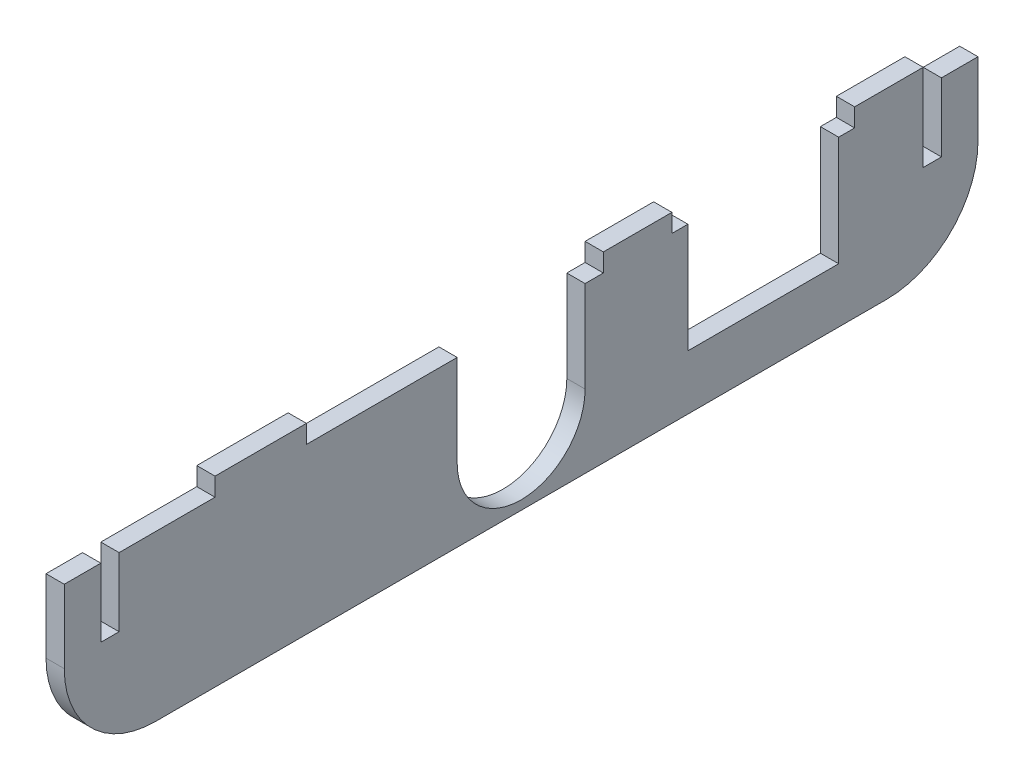
ISO-10303-21;
HEADER;
FILE_DESCRIPTION(('STEP AP214'),'2;1');
FILE_NAME('part.step','',(''),(''),'','','');
FILE_SCHEMA(('AUTOMOTIVE_DESIGN { 1 0 10303 214 1 1 1 1 }'));
ENDSEC;
DATA;
#1=APPLICATION_CONTEXT('core data for automotive mechanical design processes');
#2=APPLICATION_PROTOCOL_DEFINITION('international standard','automotive_design',2000,#1);
#3=PRODUCT_CONTEXT('',#1,'mechanical');
#4=PRODUCT('Part','Part','',(#3));
#5=PRODUCT_RELATED_PRODUCT_CATEGORY('part','',(#4));
#6=PRODUCT_DEFINITION_FORMATION('','',#4);
#7=PRODUCT_DEFINITION_CONTEXT('part definition',#1,'design');
#8=PRODUCT_DEFINITION('design','',#6,#7);
#9=PRODUCT_DEFINITION_SHAPE('','',#8);
#10=(LENGTH_UNIT() NAMED_UNIT(*) SI_UNIT(.MILLI.,.METRE.));
#11=(NAMED_UNIT(*) PLANE_ANGLE_UNIT() SI_UNIT($,.RADIAN.));
#12=(NAMED_UNIT(*) SI_UNIT($,.STERADIAN.) SOLID_ANGLE_UNIT());
#13=UNCERTAINTY_MEASURE_WITH_UNIT(LENGTH_MEASURE(1.E-05),#10,'distance_accuracy_value','');
#14=(GEOMETRIC_REPRESENTATION_CONTEXT(3) GLOBAL_UNCERTAINTY_ASSIGNED_CONTEXT((#13)) GLOBAL_UNIT_ASSIGNED_CONTEXT((#10,
#11,#12)) REPRESENTATION_CONTEXT('',''));
#15=CARTESIAN_POINT('',(0.,0.,0.));
#16=DIRECTION('',(0.,0.,1.));
#17=DIRECTION('',(1.,0.,0.));
#18=AXIS2_PLACEMENT_3D('',#15,#16,#17);
#19=CARTESIAN_POINT('',(5.08,45.72,0.));
#20=DIRECTION('',(0.,-1.,0.));
#21=DIRECTION('',(0.,0.,-1.));
#22=AXIS2_PLACEMENT_3D('',#19,#20,#21);
#23=PLANE('',#22);
#24=DIRECTION('',(0.,0.,1.));
#25=VECTOR('',#24,1.);
#26=CARTESIAN_POINT('',(0.,45.72,0.));
#27=LINE('',#26,#25);
#28=CARTESIAN_POINT('',(0.,45.72,-219.71));
#29=VERTEX_POINT('',#28);
#30=CARTESIAN_POINT('',(0.,45.72,-215.265));
#31=VERTEX_POINT('',#30);
#32=EDGE_CURVE('E258',#29,#31,#27,.T.);
#33=ORIENTED_EDGE('',*,*,#32,.T.);
#34=DIRECTION('',(1.,0.,0.));
#35=VECTOR('',#34,1.);
#36=CARTESIAN_POINT('',(0.,45.72,-215.265));
#37=LINE('',#36,#35);
#38=CARTESIAN_POINT('',(5.08,45.72,-215.265));
#39=VERTEX_POINT('',#38);
#40=EDGE_CURVE('E242',#31,#39,#37,.T.);
#41=ORIENTED_EDGE('',*,*,#40,.T.);
#42=DIRECTION('',(0.,0.,1.));
#43=VECTOR('',#42,1.);
#44=CARTESIAN_POINT('',(5.08,45.72,0.));
#45=LINE('',#44,#43);
#46=CARTESIAN_POINT('',(5.08,45.72,-219.71));
#47=VERTEX_POINT('',#46);
#48=EDGE_CURVE('E394',#47,#39,#45,.T.);
#49=ORIENTED_EDGE('',*,*,#48,.F.);
#50=DIRECTION('',(1.,0.,0.));
#51=VECTOR('',#50,1.);
#52=CARTESIAN_POINT('',(0.,45.72,-219.71));
#53=LINE('',#52,#51);
#54=EDGE_CURVE('E264',#29,#47,#53,.T.);
#55=ORIENTED_EDGE('',*,*,#54,.F.);
#56=EDGE_LOOP('',(#33,#41,#49,#55));
#57=FACE_BOUND('',#56,.T.);
#58=ADVANCED_FACE('F32',(#57),#23,.F.);
#59=DIRECTION('',(1.,0.,0.));
#60=VECTOR('',#59,1.);
#61=CARTESIAN_POINT('',(0.,45.72,-149.86));
#62=LINE('',#61,#60);
#63=CARTESIAN_POINT('',(0.,45.72,-149.86));
#64=VERTEX_POINT('',#63);
#65=CARTESIAN_POINT('',(5.08,45.72,-149.86));
#66=VERTEX_POINT('',#65);
#67=EDGE_CURVE('E501',#64,#66,#62,.T.);
#68=ORIENTED_EDGE('',*,*,#67,.F.);
#69=CARTESIAN_POINT('',(0.,45.72,-144.78));
#70=VERTEX_POINT('',#69);
#71=EDGE_CURVE('E269',#64,#70,#27,.T.);
#72=ORIENTED_EDGE('',*,*,#71,.T.);
#73=DIRECTION('',(1.,0.,0.));
#74=VECTOR('',#73,1.);
#75=CARTESIAN_POINT('',(0.,45.72,-144.78));
#76=LINE('',#75,#74);
#77=CARTESIAN_POINT('',(5.08,45.72,-144.78));
#78=VERTEX_POINT('',#77);
#79=EDGE_CURVE('E400',#70,#78,#76,.T.);
#80=ORIENTED_EDGE('',*,*,#79,.T.);
#81=EDGE_CURVE('E55',#66,#78,#45,.T.);
#82=ORIENTED_EDGE('',*,*,#81,.F.);
#83=EDGE_LOOP('',(#68,#72,#80,#82));
#84=FACE_BOUND('',#83,.T.);
#85=ADVANCED_FACE('F562',(#84),#23,.F.);
#86=CARTESIAN_POINT('',(5.08,45.72,-173.355));
#87=VERTEX_POINT('',#86);
#88=CARTESIAN_POINT('',(5.08,45.72,-168.91));
#89=VERTEX_POINT('',#88);
#90=EDGE_CURVE('E531',#87,#89,#45,.T.);
#91=ORIENTED_EDGE('',*,*,#90,.F.);
#92=DIRECTION('',(1.,0.,0.));
#93=VECTOR('',#92,1.);
#94=CARTESIAN_POINT('',(0.,45.72,-173.355));
#95=LINE('',#94,#93);
#96=CARTESIAN_POINT('',(0.,45.72,-173.355));
#97=VERTEX_POINT('',#96);
#98=EDGE_CURVE('E252',#97,#87,#95,.T.);
#99=ORIENTED_EDGE('',*,*,#98,.F.);
#100=CARTESIAN_POINT('',(0.,45.72,-168.91));
#101=VERTEX_POINT('',#100);
#102=EDGE_CURVE('E266',#97,#101,#27,.T.);
#103=ORIENTED_EDGE('',*,*,#102,.T.);
#104=DIRECTION('',(-1.,0.,0.));
#105=VECTOR('',#104,1.);
#106=CARTESIAN_POINT('',(0.,45.72,-168.91));
#107=LINE('',#106,#105);
#108=EDGE_CURVE('E497',#89,#101,#107,.T.);
#109=ORIENTED_EDGE('',*,*,#108,.F.);
#110=EDGE_LOOP('',(#91,#99,#103,#109));
#111=FACE_BOUND('',#110,.T.);
#112=ADVANCED_FACE('F529',(#111),#23,.F.);
#113=DIRECTION('',(1.,0.,0.));
#114=VECTOR('',#113,1.);
#115=CARTESIAN_POINT('',(-26.67,45.72,-243.84));
#116=LINE('',#115,#114);
#117=CARTESIAN_POINT('',(0.,45.72,-243.84));
#118=VERTEX_POINT('',#117);
#119=CARTESIAN_POINT('',(5.08,45.72,-243.84));
#120=VERTEX_POINT('',#119);
#121=EDGE_CURVE('E320',#118,#120,#116,.T.);
#122=ORIENTED_EDGE('',*,*,#121,.T.);
#123=CARTESIAN_POINT('',(5.08,45.72,-254.));
#124=VERTEX_POINT('',#123);
#125=EDGE_CURVE('E324',#124,#120,#45,.T.);
#126=ORIENTED_EDGE('',*,*,#125,.F.);
#127=DIRECTION('',(-1.,0.,0.));
#128=VECTOR('',#127,1.);
#129=CARTESIAN_POINT('',(5.08,45.72,-254.));
#130=LINE('',#129,#128);
#131=CARTESIAN_POINT('',(0.,45.72,-254.));
#132=VERTEX_POINT('',#131);
#133=EDGE_CURVE('E323',#124,#132,#130,.T.);
#134=ORIENTED_EDGE('',*,*,#133,.T.);
#135=EDGE_CURVE('E265',#132,#118,#27,.T.);
#136=ORIENTED_EDGE('',*,*,#135,.T.);
#137=EDGE_LOOP('',(#122,#126,#134,#136));
#138=FACE_BOUND('',#137,.T.);
#139=ADVANCED_FACE('F318',(#138),#23,.F.);
#140=CARTESIAN_POINT('',(5.08,0.,0.));
#141=DIRECTION('',(-1.,0.,0.));
#142=DIRECTION('',(0.,0.,1.));
#143=AXIS2_PLACEMENT_3D('',#140,#141,#142);
#144=PLANE('',#143);
#145=ORIENTED_EDGE('',*,*,#48,.T.);
#146=DIRECTION('',(0.,1.,0.));
#147=VECTOR('',#146,1.);
#148=CARTESIAN_POINT('',(5.08,15.24,-215.265));
#149=LINE('',#148,#147);
#150=CARTESIAN_POINT('',(5.08,15.24,-215.265));
#151=VERTEX_POINT('',#150);
#152=EDGE_CURVE('E247',#151,#39,#149,.T.);
#153=ORIENTED_EDGE('',*,*,#152,.F.);
#154=DIRECTION('',(0.,0.,-1.));
#155=VECTOR('',#154,1.);
#156=CARTESIAN_POINT('',(5.08,15.24,-173.355));
#157=LINE('',#156,#155);
#158=CARTESIAN_POINT('',(5.08,15.24,-173.355));
#159=VERTEX_POINT('',#158);
#160=EDGE_CURVE('E261',#159,#151,#157,.T.);
#161=ORIENTED_EDGE('',*,*,#160,.F.);
#162=DIRECTION('',(0.,-1.,0.));
#163=VECTOR('',#162,1.);
#164=CARTESIAN_POINT('',(5.08,15.24,-173.355));
#165=LINE('',#164,#163);
#166=EDGE_CURVE('E517',#87,#159,#165,.T.);
#167=ORIENTED_EDGE('',*,*,#166,.F.);
#168=ORIENTED_EDGE('',*,*,#90,.T.);
#169=DIRECTION('',(0.,-1.,0.));
#170=VECTOR('',#169,1.);
#171=CARTESIAN_POINT('',(5.08,50.8,-168.91));
#172=LINE('',#171,#170);
#173=CARTESIAN_POINT('',(5.08,50.8,-168.91));
#174=VERTEX_POINT('',#173);
#175=EDGE_CURVE('E490',#174,#89,#172,.T.);
#176=ORIENTED_EDGE('',*,*,#175,.F.);
#177=DIRECTION('',(0.,0.,-1.));
#178=VECTOR('',#177,1.);
#179=CARTESIAN_POINT('',(5.08,50.8,-168.91));
#180=LINE('',#179,#178);
#181=CARTESIAN_POINT('',(5.08,50.8,-149.86));
#182=VERTEX_POINT('',#181);
#183=EDGE_CURVE('E505',#182,#174,#180,.T.);
#184=ORIENTED_EDGE('',*,*,#183,.F.);
#185=DIRECTION('',(0.,-1.,0.));
#186=VECTOR('',#185,1.);
#187=CARTESIAN_POINT('',(5.08,50.8,-149.86));
#188=LINE('',#187,#186);
#189=EDGE_CURVE('E487',#182,#66,#188,.T.);
#190=ORIENTED_EDGE('',*,*,#189,.T.);
#191=ORIENTED_EDGE('',*,*,#81,.T.);
#192=DIRECTION('',(0.,1.,0.));
#193=VECTOR('',#192,1.);
#194=CARTESIAN_POINT('',(5.08,20.32,-144.78));
#195=LINE('',#194,#193);
#196=CARTESIAN_POINT('',(5.08,20.32,-144.78));
#197=VERTEX_POINT('',#196);
#198=EDGE_CURVE('E411',#197,#78,#195,.T.);
#199=ORIENTED_EDGE('',*,*,#198,.F.);
#200=CARTESIAN_POINT('',(5.08,20.32,-127.));
#201=DIRECTION('',(1.,0.,0.));
#202=DIRECTION('',(0.,0.,-1.));
#203=AXIS2_PLACEMENT_3D('',#200,#201,#202);
#204=CIRCLE('',#203,17.78);
#205=CARTESIAN_POINT('',(5.08,20.32,-109.22));
#206=VERTEX_POINT('',#205);
#207=EDGE_CURVE('E374',#206,#197,#204,.T.);
#208=ORIENTED_EDGE('',*,*,#207,.F.);
#209=DIRECTION('',(0.,-1.,0.));
#210=VECTOR('',#209,1.);
#211=CARTESIAN_POINT('',(5.08,20.32,-109.22));
#212=LINE('',#211,#210);
#213=CARTESIAN_POINT('',(5.08,45.72,-109.22));
#214=VERTEX_POINT('',#213);
#215=EDGE_CURVE('E415',#214,#206,#212,.T.);
#216=ORIENTED_EDGE('',*,*,#215,.F.);
#217=CARTESIAN_POINT('',(5.08,45.72,-67.31));
#218=VERTEX_POINT('',#217);
#219=EDGE_CURVE('E533',#214,#218,#45,.T.);
#220=ORIENTED_EDGE('',*,*,#219,.T.);
#221=DIRECTION('',(0.,-1.,0.));
#222=VECTOR('',#221,1.);
#223=CARTESIAN_POINT('',(5.08,50.8,-67.31));
#224=LINE('',#223,#222);
#225=CARTESIAN_POINT('',(5.08,50.8,-67.31));
#226=VERTEX_POINT('',#225);
#227=EDGE_CURVE('E425',#226,#218,#224,.T.);
#228=ORIENTED_EDGE('',*,*,#227,.F.);
#229=DIRECTION('',(0.,0.,-1.));
#230=VECTOR('',#229,1.);
#231=CARTESIAN_POINT('',(5.08,50.8,-41.91));
#232=LINE('',#231,#230);
#233=CARTESIAN_POINT('',(5.08,50.8,-41.91));
#234=VERTEX_POINT('',#233);
#235=EDGE_CURVE('E438',#234,#226,#232,.T.);
#236=ORIENTED_EDGE('',*,*,#235,.F.);
#237=DIRECTION('',(0.,-1.,0.));
#238=VECTOR('',#237,1.);
#239=CARTESIAN_POINT('',(5.08,50.8,-41.91));
#240=LINE('',#239,#238);
#241=CARTESIAN_POINT('',(5.08,45.72,-41.91));
#242=VERTEX_POINT('',#241);
#243=EDGE_CURVE('E422',#234,#242,#240,.T.);
#244=ORIENTED_EDGE('',*,*,#243,.T.);
#245=CARTESIAN_POINT('',(5.08,45.72,-15.24));
#246=VERTEX_POINT('',#245);
#247=EDGE_CURVE('E393',#242,#246,#45,.T.);
#248=ORIENTED_EDGE('',*,*,#247,.T.);
#249=DIRECTION('',(0.,1.,0.));
#250=VECTOR('',#249,1.);
#251=CARTESIAN_POINT('',(5.08,26.67,-15.24));
#252=LINE('',#251,#250);
#253=CARTESIAN_POINT('',(5.08,26.67,-15.24));
#254=VERTEX_POINT('',#253);
#255=EDGE_CURVE('E452',#254,#246,#252,.T.);
#256=ORIENTED_EDGE('',*,*,#255,.F.);
#257=DIRECTION('',(0.,0.,-1.));
#258=VECTOR('',#257,1.);
#259=CARTESIAN_POINT('',(5.08,26.67,-10.16));
#260=LINE('',#259,#258);
#261=CARTESIAN_POINT('',(5.08,26.67,-10.16));
#262=VERTEX_POINT('',#261);
#263=EDGE_CURVE('E444',#262,#254,#260,.T.);
#264=ORIENTED_EDGE('',*,*,#263,.F.);
#265=DIRECTION('',(0.,-1.,0.));
#266=VECTOR('',#265,1.);
#267=CARTESIAN_POINT('',(5.08,26.67,-10.16));
#268=LINE('',#267,#266);
#269=CARTESIAN_POINT('',(5.08,45.72,-10.16));
#270=VERTEX_POINT('',#269);
#271=EDGE_CURVE('E450',#270,#262,#268,.T.);
#272=ORIENTED_EDGE('',*,*,#271,.F.);
#273=CARTESIAN_POINT('',(5.08,45.72,0.));
#274=VERTEX_POINT('',#273);
#275=EDGE_CURVE('E360',#270,#274,#45,.T.);
#276=ORIENTED_EDGE('',*,*,#275,.T.);
#277=DIRECTION('',(0.,-1.,0.));
#278=VECTOR('',#277,1.);
#279=CARTESIAN_POINT('',(5.08,0.,0.));
#280=LINE('',#279,#278);
#281=CARTESIAN_POINT('',(5.08,25.4,0.));
#282=VERTEX_POINT('',#281);
#283=EDGE_CURVE('E271',#274,#282,#280,.T.);
#284=ORIENTED_EDGE('',*,*,#283,.T.);
#285=CARTESIAN_POINT('',(5.08,25.4,-25.4));
#286=DIRECTION('',(-1.,0.,0.));
#287=DIRECTION('',(0.,0.,1.));
#288=AXIS2_PLACEMENT_3D('',#285,#286,#287);
#289=CIRCLE('',#288,25.4);
#290=CARTESIAN_POINT('',(5.08,0.,-25.4));
#291=VERTEX_POINT('',#290);
#292=EDGE_CURVE('E343',#282,#291,#289,.F.);
#293=ORIENTED_EDGE('',*,*,#292,.T.);
#294=DIRECTION('',(0.,0.,-1.));
#295=VECTOR('',#294,1.);
#296=CARTESIAN_POINT('',(5.08,0.,0.));
#297=LINE('',#296,#295);
#298=CARTESIAN_POINT('',(5.08,0.,-228.6));
#299=VERTEX_POINT('',#298);
#300=EDGE_CURVE('E392',#291,#299,#297,.T.);
#301=ORIENTED_EDGE('',*,*,#300,.T.);
#302=CARTESIAN_POINT('',(5.08,25.4,-228.6));
#303=DIRECTION('',(-1.,0.,0.));
#304=DIRECTION('',(0.,0.,1.));
#305=AXIS2_PLACEMENT_3D('',#302,#303,#304);
#306=CIRCLE('',#305,25.4);
#307=CARTESIAN_POINT('',(5.08,25.4,-254.));
#308=VERTEX_POINT('',#307);
#309=EDGE_CURVE('E345',#299,#308,#306,.F.);
#310=ORIENTED_EDGE('',*,*,#309,.T.);
#311=DIRECTION('',(0.,1.,0.));
#312=VECTOR('',#311,1.);
#313=CARTESIAN_POINT('',(5.08,0.,-254.));
#314=LINE('',#313,#312);
#315=EDGE_CURVE('E391',#308,#124,#314,.T.);
#316=ORIENTED_EDGE('',*,*,#315,.T.);
#317=ORIENTED_EDGE('',*,*,#125,.T.);
#318=DIRECTION('',(0.,-1.,0.));
#319=VECTOR('',#318,1.);
#320=CARTESIAN_POINT('',(5.08,26.67,-243.84));
#321=LINE('',#320,#319);
#322=CARTESIAN_POINT('',(5.08,26.67,-243.84));
#323=VERTEX_POINT('',#322);
#324=EDGE_CURVE('E457',#120,#323,#321,.T.);
#325=ORIENTED_EDGE('',*,*,#324,.T.);
#326=DIRECTION('',(0.,0.,1.));
#327=VECTOR('',#326,1.);
#328=CARTESIAN_POINT('',(5.08,26.67,-243.84));
#329=LINE('',#328,#327);
#330=CARTESIAN_POINT('',(5.08,26.67,-238.76));
#331=VERTEX_POINT('',#330);
#332=EDGE_CURVE('E462',#323,#331,#329,.T.);
#333=ORIENTED_EDGE('',*,*,#332,.T.);
#334=DIRECTION('',(0.,1.,0.));
#335=VECTOR('',#334,1.);
#336=CARTESIAN_POINT('',(5.08,26.67,-238.76));
#337=LINE('',#336,#335);
#338=CARTESIAN_POINT('',(5.08,50.8,-238.76));
#339=VERTEX_POINT('',#338);
#340=EDGE_CURVE('E465',#331,#339,#337,.T.);
#341=ORIENTED_EDGE('',*,*,#340,.T.);
#342=DIRECTION('',(0.,0.,-1.));
#343=VECTOR('',#342,1.);
#344=CARTESIAN_POINT('',(5.08,50.8,-238.76));
#345=LINE('',#344,#343);
#346=CARTESIAN_POINT('',(5.08,50.8,-219.71));
#347=VERTEX_POINT('',#346);
#348=EDGE_CURVE('E478',#347,#339,#345,.T.);
#349=ORIENTED_EDGE('',*,*,#348,.F.);
#350=DIRECTION('',(0.,-1.,0.));
#351=VECTOR('',#350,1.);
#352=CARTESIAN_POINT('',(5.08,50.8,-219.71));
#353=LINE('',#352,#351);
#354=EDGE_CURVE('E469',#347,#47,#353,.T.);
#355=ORIENTED_EDGE('',*,*,#354,.T.);
#356=EDGE_LOOP('',(#145,#153,#161,#167,#168,#176,#184,#190,#191,#199,#208,#216,#220,#228,#236,
#244,#248,#256,#264,#272,#276,#284,#293,#301,#310,#316,#317,#325,#333,#341,#349,#355));
#357=FACE_BOUND('',#356,.T.);
#358=ADVANCED_FACE('F390',(#357),#144,.F.);
#359=CARTESIAN_POINT('',(0.,0.,0.));
#360=DIRECTION('',(-1.,0.,0.));
#361=DIRECTION('',(0.,0.,1.));
#362=AXIS2_PLACEMENT_3D('',#359,#360,#361);
#363=PLANE('',#362);
#364=DIRECTION('',(0.,1.,0.));
#365=VECTOR('',#364,1.);
#366=CARTESIAN_POINT('',(0.,15.24,-215.265));
#367=LINE('',#366,#365);
#368=CARTESIAN_POINT('',(0.,15.24,-215.265));
#369=VERTEX_POINT('',#368);
#370=EDGE_CURVE('E245',#369,#31,#367,.T.);
#371=ORIENTED_EDGE('',*,*,#370,.T.);
#372=ORIENTED_EDGE('',*,*,#32,.F.);
#373=DIRECTION('',(0.,-1.,0.));
#374=VECTOR('',#373,1.);
#375=CARTESIAN_POINT('',(0.,50.8,-219.71));
#376=LINE('',#375,#374);
#377=CARTESIAN_POINT('',(0.,50.8,-219.71));
#378=VERTEX_POINT('',#377);
#379=EDGE_CURVE('E467',#378,#29,#376,.T.);
#380=ORIENTED_EDGE('',*,*,#379,.F.);
#381=DIRECTION('',(0.,0.,1.));
#382=VECTOR('',#381,1.);
#383=CARTESIAN_POINT('',(0.,50.8,-238.76));
#384=LINE('',#383,#382);
#385=CARTESIAN_POINT('',(0.,50.8,-238.76));
#386=VERTEX_POINT('',#385);
#387=EDGE_CURVE('E474',#386,#378,#384,.T.);
#388=ORIENTED_EDGE('',*,*,#387,.F.);
#389=DIRECTION('',(0.,-1.,0.));
#390=VECTOR('',#389,1.);
#391=CARTESIAN_POINT('',(0.,0.,-238.76));
#392=LINE('',#391,#390);
#393=CARTESIAN_POINT('',(0.,26.67,-238.76));
#394=VERTEX_POINT('',#393);
#395=EDGE_CURVE('E11',#386,#394,#392,.T.);
#396=ORIENTED_EDGE('',*,*,#395,.T.);
#397=DIRECTION('',(0.,0.,-1.));
#398=VECTOR('',#397,1.);
#399=CARTESIAN_POINT('',(0.,26.67,0.));
#400=LINE('',#399,#398);
#401=CARTESIAN_POINT('',(0.,26.67,-243.84));
#402=VERTEX_POINT('',#401);
#403=EDGE_CURVE('E303',#394,#402,#400,.T.);
#404=ORIENTED_EDGE('',*,*,#403,.T.);
#405=DIRECTION('',(0.,1.,0.));
#406=VECTOR('',#405,1.);
#407=CARTESIAN_POINT('',(0.,0.,-243.84));
#408=LINE('',#407,#406);
#409=EDGE_CURVE('E40',#402,#118,#408,.T.);
#410=ORIENTED_EDGE('',*,*,#409,.T.);
#411=ORIENTED_EDGE('',*,*,#135,.F.);
#412=DIRECTION('',(0.,1.,0.));
#413=VECTOR('',#412,1.);
#414=CARTESIAN_POINT('',(0.,0.,-254.));
#415=LINE('',#414,#413);
#416=CARTESIAN_POINT('',(0.,25.4,-254.));
#417=VERTEX_POINT('',#416);
#418=EDGE_CURVE('E276',#417,#132,#415,.T.);
#419=ORIENTED_EDGE('',*,*,#418,.F.);
#420=CARTESIAN_POINT('',(0.,25.4,-228.6));
#421=DIRECTION('',(-1.,0.,0.));
#422=DIRECTION('',(0.,0.,1.));
#423=AXIS2_PLACEMENT_3D('',#420,#421,#422);
#424=CIRCLE('',#423,25.4);
#425=CARTESIAN_POINT('',(0.,0.,-228.6));
#426=VERTEX_POINT('',#425);
#427=EDGE_CURVE('E336',#417,#426,#424,.T.);
#428=ORIENTED_EDGE('',*,*,#427,.T.);
#429=DIRECTION('',(0.,0.,-1.));
#430=VECTOR('',#429,1.);
#431=CARTESIAN_POINT('',(0.,0.,0.));
#432=LINE('',#431,#430);
#433=CARTESIAN_POINT('',(0.,0.,-25.4));
#434=VERTEX_POINT('',#433);
#435=EDGE_CURVE('E368',#434,#426,#432,.T.);
#436=ORIENTED_EDGE('',*,*,#435,.F.);
#437=CARTESIAN_POINT('',(0.,25.4,-25.4));
#438=DIRECTION('',(-1.,0.,0.));
#439=DIRECTION('',(0.,0.,1.));
#440=AXIS2_PLACEMENT_3D('',#437,#438,#439);
#441=CIRCLE('',#440,25.4);
#442=CARTESIAN_POINT('',(0.,25.4,0.));
#443=VERTEX_POINT('',#442);
#444=EDGE_CURVE('E331',#434,#443,#441,.T.);
#445=ORIENTED_EDGE('',*,*,#444,.T.);
#446=DIRECTION('',(0.,-1.,0.));
#447=VECTOR('',#446,1.);
#448=CARTESIAN_POINT('',(0.,0.,0.));
#449=LINE('',#448,#447);
#450=CARTESIAN_POINT('',(0.,45.72,0.));
#451=VERTEX_POINT('',#450);
#452=EDGE_CURVE('E364',#451,#443,#449,.T.);
#453=ORIENTED_EDGE('',*,*,#452,.F.);
#454=CARTESIAN_POINT('',(0.,45.72,-10.16));
#455=VERTEX_POINT('',#454);
#456=EDGE_CURVE('E268',#455,#451,#27,.T.);
#457=ORIENTED_EDGE('',*,*,#456,.F.);
#458=DIRECTION('',(0.,1.,0.));
#459=VECTOR('',#458,1.);
#460=CARTESIAN_POINT('',(0.,0.,-10.16));
#461=LINE('',#460,#459);
#462=CARTESIAN_POINT('',(0.,26.67,-10.16));
#463=VERTEX_POINT('',#462);
#464=EDGE_CURVE('E307',#463,#455,#461,.T.);
#465=ORIENTED_EDGE('',*,*,#464,.F.);
#466=DIRECTION('',(0.,0.,1.));
#467=VECTOR('',#466,1.);
#468=CARTESIAN_POINT('',(0.,26.67,0.));
#469=LINE('',#468,#467);
#470=CARTESIAN_POINT('',(0.,26.67,-15.24));
#471=VERTEX_POINT('',#470);
#472=EDGE_CURVE('E300',#471,#463,#469,.T.);
#473=ORIENTED_EDGE('',*,*,#472,.F.);
#474=DIRECTION('',(0.,-1.,0.));
#475=VECTOR('',#474,1.);
#476=CARTESIAN_POINT('',(0.,0.,-15.24));
#477=LINE('',#476,#475);
#478=CARTESIAN_POINT('',(0.,45.72,-15.24));
#479=VERTEX_POINT('',#478);
#480=EDGE_CURVE('E297',#479,#471,#477,.T.);
#481=ORIENTED_EDGE('',*,*,#480,.F.);
#482=CARTESIAN_POINT('',(0.,45.72,-41.91));
#483=VERTEX_POINT('',#482);
#484=EDGE_CURVE('E275',#483,#479,#27,.T.);
#485=ORIENTED_EDGE('',*,*,#484,.F.);
#486=DIRECTION('',(0.,-1.,0.));
#487=VECTOR('',#486,1.);
#488=CARTESIAN_POINT('',(0.,50.8,-41.91));
#489=LINE('',#488,#487);
#490=CARTESIAN_POINT('',(0.,50.8,-41.91));
#491=VERTEX_POINT('',#490);
#492=EDGE_CURVE('E295',#491,#483,#489,.T.);
#493=ORIENTED_EDGE('',*,*,#492,.F.);
#494=DIRECTION('',(0.,0.,1.));
#495=VECTOR('',#494,1.);
#496=CARTESIAN_POINT('',(0.,50.8,-41.91));
#497=LINE('',#496,#495);
#498=CARTESIAN_POINT('',(0.,50.8,-67.31));
#499=VERTEX_POINT('',#498);
#500=EDGE_CURVE('E434',#499,#491,#497,.T.);
#501=ORIENTED_EDGE('',*,*,#500,.F.);
#502=DIRECTION('',(0.,-1.,0.));
#503=VECTOR('',#502,1.);
#504=CARTESIAN_POINT('',(0.,50.8,-67.31));
#505=LINE('',#504,#503);
#506=CARTESIAN_POINT('',(0.,45.72,-67.31));
#507=VERTEX_POINT('',#506);
#508=EDGE_CURVE('E428',#499,#507,#505,.T.);
#509=ORIENTED_EDGE('',*,*,#508,.T.);
#510=CARTESIAN_POINT('',(0.,45.72,-109.22));
#511=VERTEX_POINT('',#510);
#512=EDGE_CURVE('E272',#511,#507,#27,.T.);
#513=ORIENTED_EDGE('',*,*,#512,.F.);
#514=DIRECTION('',(0.,-1.,0.));
#515=VECTOR('',#514,1.);
#516=CARTESIAN_POINT('',(0.,20.32,-109.22));
#517=LINE('',#516,#515);
#518=CARTESIAN_POINT('',(0.,20.32,-109.22));
#519=VERTEX_POINT('',#518);
#520=EDGE_CURVE('E414',#511,#519,#517,.T.);
#521=ORIENTED_EDGE('',*,*,#520,.T.);
#522=CARTESIAN_POINT('',(0.,20.32,-127.));
#523=DIRECTION('',(1.,0.,0.));
#524=DIRECTION('',(0.,0.,-1.));
#525=AXIS2_PLACEMENT_3D('',#522,#523,#524);
#526=CIRCLE('',#525,17.78);
#527=CARTESIAN_POINT('',(0.,20.32,-144.78));
#528=VERTEX_POINT('',#527);
#529=EDGE_CURVE('E369',#519,#528,#526,.T.);
#530=ORIENTED_EDGE('',*,*,#529,.T.);
#531=DIRECTION('',(0.,1.,0.));
#532=VECTOR('',#531,1.);
#533=CARTESIAN_POINT('',(0.,20.32,-144.78));
#534=LINE('',#533,#532);
#535=EDGE_CURVE('E405',#528,#70,#534,.T.);
#536=ORIENTED_EDGE('',*,*,#535,.T.);
#537=ORIENTED_EDGE('',*,*,#71,.F.);
#538=DIRECTION('',(0.,-1.,0.));
#539=VECTOR('',#538,1.);
#540=CARTESIAN_POINT('',(0.,50.8,-149.86));
#541=LINE('',#540,#539);
#542=CARTESIAN_POINT('',(0.,50.8,-149.86));
#543=VERTEX_POINT('',#542);
#544=EDGE_CURVE('E475',#543,#64,#541,.T.);
#545=ORIENTED_EDGE('',*,*,#544,.F.);
#546=DIRECTION('',(0.,0.,1.));
#547=VECTOR('',#546,1.);
#548=CARTESIAN_POINT('',(0.,50.8,-168.91));
#549=LINE('',#548,#547);
#550=CARTESIAN_POINT('',(0.,50.8,-168.91));
#551=VERTEX_POINT('',#550);
#552=EDGE_CURVE('E500',#551,#543,#549,.T.);
#553=ORIENTED_EDGE('',*,*,#552,.F.);
#554=DIRECTION('',(0.,-1.,0.));
#555=VECTOR('',#554,1.);
#556=CARTESIAN_POINT('',(0.,50.8,-168.91));
#557=LINE('',#556,#555);
#558=EDGE_CURVE('E493',#551,#101,#557,.T.);
#559=ORIENTED_EDGE('',*,*,#558,.T.);
#560=ORIENTED_EDGE('',*,*,#102,.F.);
#561=DIRECTION('',(0.,-1.,0.));
#562=VECTOR('',#561,1.);
#563=CARTESIAN_POINT('',(0.,15.24,-173.355));
#564=LINE('',#563,#562);
#565=CARTESIAN_POINT('',(0.,15.24,-173.355));
#566=VERTEX_POINT('',#565);
#567=EDGE_CURVE('E260',#97,#566,#564,.T.);
#568=ORIENTED_EDGE('',*,*,#567,.T.);
#569=DIRECTION('',(0.,0.,-1.));
#570=VECTOR('',#569,1.);
#571=CARTESIAN_POINT('',(0.,15.24,-173.355));
#572=LINE('',#571,#570);
#573=EDGE_CURVE('E47',#566,#369,#572,.T.);
#574=ORIENTED_EDGE('',*,*,#573,.T.);
#575=EDGE_LOOP('',(#371,#372,#380,#388,#396,#404,#410,#411,#419,#428,#436,#445,#453,#457,#465,
#473,#481,#485,#493,#501,#509,#513,#521,#530,#536,#537,#545,#553,#559,#560,#568,#574));
#576=FACE_BOUND('',#575,.T.);
#577=ADVANCED_FACE('F256',(#576),#363,.T.);
#578=ORIENTED_EDGE('',*,*,#484,.T.);
#579=DIRECTION('',(1.,0.,0.));
#580=VECTOR('',#579,1.);
#581=CARTESIAN_POINT('',(-26.67,45.72,-15.24));
#582=LINE('',#581,#580);
#583=EDGE_CURVE('E287',#479,#246,#582,.T.);
#584=ORIENTED_EDGE('',*,*,#583,.T.);
#585=ORIENTED_EDGE('',*,*,#247,.F.);
#586=DIRECTION('',(1.,0.,0.));
#587=VECTOR('',#586,1.);
#588=CARTESIAN_POINT('',(5.08,45.72,-41.91));
#589=LINE('',#588,#587);
#590=EDGE_CURVE('E290',#483,#242,#589,.T.);
#591=ORIENTED_EDGE('',*,*,#590,.F.);
#592=EDGE_LOOP('',(#578,#584,#585,#591));
#593=FACE_BOUND('',#592,.T.);
#594=ADVANCED_FACE('F286',(#593),#23,.F.);
#595=ORIENTED_EDGE('',*,*,#275,.F.);
#596=DIRECTION('',(1.,0.,0.));
#597=VECTOR('',#596,1.);
#598=CARTESIAN_POINT('',(-26.67,45.72,-10.16));
#599=LINE('',#598,#597);
#600=EDGE_CURVE('E352',#455,#270,#599,.T.);
#601=ORIENTED_EDGE('',*,*,#600,.F.);
#602=ORIENTED_EDGE('',*,*,#456,.T.);
#603=DIRECTION('',(-1.,0.,0.));
#604=VECTOR('',#603,1.);
#605=CARTESIAN_POINT('',(5.08,45.72,0.));
#606=LINE('',#605,#604);
#607=EDGE_CURVE('E328',#274,#451,#606,.T.);
#608=ORIENTED_EDGE('',*,*,#607,.F.);
#609=EDGE_LOOP('',(#595,#601,#602,#608));
#610=FACE_BOUND('',#609,.T.);
#611=ADVANCED_FACE('F358',(#610),#23,.F.);
#612=DIRECTION('',(-1.,0.,0.));
#613=VECTOR('',#612,1.);
#614=CARTESIAN_POINT('',(5.08,45.72,-67.31));
#615=LINE('',#614,#613);
#616=EDGE_CURVE('E432',#218,#507,#615,.T.);
#617=ORIENTED_EDGE('',*,*,#616,.F.);
#618=ORIENTED_EDGE('',*,*,#219,.F.);
#619=DIRECTION('',(1.,0.,0.));
#620=VECTOR('',#619,1.);
#621=CARTESIAN_POINT('',(0.,45.72,-109.22));
#622=LINE('',#621,#620);
#623=EDGE_CURVE('E402',#511,#214,#622,.T.);
#624=ORIENTED_EDGE('',*,*,#623,.F.);
#625=ORIENTED_EDGE('',*,*,#512,.T.);
#626=EDGE_LOOP('',(#617,#618,#624,#625));
#627=FACE_BOUND('',#626,.T.);
#628=ADVANCED_FACE('F550',(#627),#23,.F.);
#629=CARTESIAN_POINT('',(5.08,0.,0.));
#630=DIRECTION('',(0.,0.,-1.));
#631=DIRECTION('',(-1.,0.,0.));
#632=AXIS2_PLACEMENT_3D('',#629,#630,#631);
#633=PLANE('',#632);
#634=ORIENTED_EDGE('',*,*,#452,.T.);
#635=DIRECTION('',(-1.,0.,0.));
#636=VECTOR('',#635,1.);
#637=CARTESIAN_POINT('',(5.08,25.4,0.));
#638=LINE('',#637,#636);
#639=EDGE_CURVE('E347',#443,#282,#638,.F.);
#640=ORIENTED_EDGE('',*,*,#639,.T.);
#641=ORIENTED_EDGE('',*,*,#283,.F.);
#642=ORIENTED_EDGE('',*,*,#607,.T.);
#643=EDGE_LOOP('',(#634,#640,#641,#642));
#644=FACE_BOUND('',#643,.T.);
#645=ADVANCED_FACE('F577',(#644),#633,.F.);
#646=CARTESIAN_POINT('',(5.08,0.,0.));
#647=DIRECTION('',(0.,1.,0.));
#648=DIRECTION('',(0.,0.,1.));
#649=AXIS2_PLACEMENT_3D('',#646,#647,#648);
#650=PLANE('',#649);
#651=ORIENTED_EDGE('',*,*,#435,.T.);
#652=DIRECTION('',(-1.,0.,0.));
#653=VECTOR('',#652,1.);
#654=CARTESIAN_POINT('',(5.08,0.,-228.6));
#655=LINE('',#654,#653);
#656=EDGE_CURVE('E341',#426,#299,#655,.F.);
#657=ORIENTED_EDGE('',*,*,#656,.T.);
#658=ORIENTED_EDGE('',*,*,#300,.F.);
#659=DIRECTION('',(-1.,0.,0.));
#660=VECTOR('',#659,1.);
#661=CARTESIAN_POINT('',(5.08,0.,-25.4));
#662=LINE('',#661,#660);
#663=EDGE_CURVE('E338',#291,#434,#662,.T.);
#664=ORIENTED_EDGE('',*,*,#663,.T.);
#665=EDGE_LOOP('',(#651,#657,#658,#664));
#666=FACE_BOUND('',#665,.T.);
#667=ADVANCED_FACE('F383',(#666),#650,.F.);
#668=CARTESIAN_POINT('',(5.08,0.,-254.));
#669=DIRECTION('',(0.,0.,1.));
#670=DIRECTION('',(1.,0.,0.));
#671=AXIS2_PLACEMENT_3D('',#668,#669,#670);
#672=PLANE('',#671);
#673=ORIENTED_EDGE('',*,*,#315,.F.);
#674=DIRECTION('',(-1.,0.,0.));
#675=VECTOR('',#674,1.);
#676=CARTESIAN_POINT('',(5.08,25.4,-254.));
#677=LINE('',#676,#675);
#678=EDGE_CURVE('E327',#308,#417,#677,.T.);
#679=ORIENTED_EDGE('',*,*,#678,.T.);
#680=ORIENTED_EDGE('',*,*,#418,.T.);
#681=ORIENTED_EDGE('',*,*,#133,.F.);
#682=EDGE_LOOP('',(#673,#679,#680,#681));
#683=FACE_BOUND('',#682,.T.);
#684=ADVANCED_FACE('F378',(#683),#672,.F.);
#685=CARTESIAN_POINT('',(0.,20.32,-127.));
#686=DIRECTION('',(1.,0.,0.));
#687=DIRECTION('',(0.,0.,-1.));
#688=AXIS2_PLACEMENT_3D('',#685,#686,#687);
#689=CYLINDRICAL_SURFACE('',#688,17.78);
#690=ORIENTED_EDGE('',*,*,#207,.T.);
#691=DIRECTION('',(1.,0.,0.));
#692=VECTOR('',#691,1.);
#693=CARTESIAN_POINT('',(0.,20.32,-144.78));
#694=LINE('',#693,#692);
#695=EDGE_CURVE('E408',#528,#197,#694,.T.);
#696=ORIENTED_EDGE('',*,*,#695,.F.);
#697=ORIENTED_EDGE('',*,*,#529,.F.);
#698=DIRECTION('',(1.,0.,0.));
#699=VECTOR('',#698,1.);
#700=CARTESIAN_POINT('',(0.,20.32,-109.22));
#701=LINE('',#700,#699);
#702=EDGE_CURVE('E404',#519,#206,#701,.T.);
#703=ORIENTED_EDGE('',*,*,#702,.T.);
#704=EDGE_LOOP('',(#690,#696,#697,#703));
#705=FACE_BOUND('',#704,.T.);
#706=ADVANCED_FACE('F557',(#705),#689,.F.);
#707=CARTESIAN_POINT('',(0.,20.32,-109.22));
#708=DIRECTION('',(0.,0.,1.));
#709=DIRECTION('',(1.,0.,0.));
#710=AXIS2_PLACEMENT_3D('',#707,#708,#709);
#711=PLANE('',#710);
#712=ORIENTED_EDGE('',*,*,#215,.T.);
#713=ORIENTED_EDGE('',*,*,#702,.F.);
#714=ORIENTED_EDGE('',*,*,#520,.F.);
#715=ORIENTED_EDGE('',*,*,#623,.T.);
#716=EDGE_LOOP('',(#712,#713,#714,#715));
#717=FACE_BOUND('',#716,.T.);
#718=ADVANCED_FACE('F552',(#717),#711,.F.);
#719=CARTESIAN_POINT('',(0.,20.32,-144.78));
#720=DIRECTION('',(0.,0.,-1.));
#721=DIRECTION('',(-1.,0.,0.));
#722=AXIS2_PLACEMENT_3D('',#719,#720,#721);
#723=PLANE('',#722);
#724=ORIENTED_EDGE('',*,*,#198,.T.);
#725=ORIENTED_EDGE('',*,*,#79,.F.);
#726=ORIENTED_EDGE('',*,*,#535,.F.);
#727=ORIENTED_EDGE('',*,*,#695,.T.);
#728=EDGE_LOOP('',(#724,#725,#726,#727));
#729=FACE_BOUND('',#728,.T.);
#730=ADVANCED_FACE('F561',(#729),#723,.F.);
#731=CARTESIAN_POINT('',(5.08,25.4,-228.6));
#732=DIRECTION('',(-1.,0.,0.));
#733=DIRECTION('',(0.,0.,1.));
#734=AXIS2_PLACEMENT_3D('',#731,#732,#733);
#735=CYLINDRICAL_SURFACE('',#734,25.4);
#736=ORIENTED_EDGE('',*,*,#309,.F.);
#737=ORIENTED_EDGE('',*,*,#656,.F.);
#738=ORIENTED_EDGE('',*,*,#427,.F.);
#739=ORIENTED_EDGE('',*,*,#678,.F.);
#740=EDGE_LOOP('',(#736,#737,#738,#739));
#741=FACE_BOUND('',#740,.T.);
#742=ADVANCED_FACE('F388',(#741),#735,.T.);
#743=CARTESIAN_POINT('',(5.08,25.4,-25.4));
#744=DIRECTION('',(-1.,0.,0.));
#745=DIRECTION('',(0.,0.,1.));
#746=AXIS2_PLACEMENT_3D('',#743,#744,#745);
#747=CYLINDRICAL_SURFACE('',#746,25.4);
#748=ORIENTED_EDGE('',*,*,#292,.F.);
#749=ORIENTED_EDGE('',*,*,#639,.F.);
#750=ORIENTED_EDGE('',*,*,#444,.F.);
#751=ORIENTED_EDGE('',*,*,#663,.F.);
#752=EDGE_LOOP('',(#748,#749,#750,#751));
#753=FACE_BOUND('',#752,.T.);
#754=ADVANCED_FACE('F34',(#753),#747,.T.);
#755=CARTESIAN_POINT('',(5.08,50.8,-41.91));
#756=DIRECTION('',(0.,0.,-1.));
#757=DIRECTION('',(-1.,0.,0.));
#758=AXIS2_PLACEMENT_3D('',#755,#756,#757);
#759=PLANE('',#758);
#760=ORIENTED_EDGE('',*,*,#590,.T.);
#761=ORIENTED_EDGE('',*,*,#243,.F.);
#762=DIRECTION('',(1.,0.,0.));
#763=VECTOR('',#762,1.);
#764=CARTESIAN_POINT('',(5.08,50.8,-41.91));
#765=LINE('',#764,#763);
#766=EDGE_CURVE('E440',#491,#234,#765,.T.);
#767=ORIENTED_EDGE('',*,*,#766,.F.);
#768=ORIENTED_EDGE('',*,*,#492,.T.);
#769=EDGE_LOOP('',(#760,#761,#767,#768));
#770=FACE_BOUND('',#769,.T.);
#771=ADVANCED_FACE('F543',(#770),#759,.F.);
#772=CARTESIAN_POINT('',(5.08,50.8,-67.31));
#773=DIRECTION('',(0.,0.,1.));
#774=DIRECTION('',(1.,0.,0.));
#775=AXIS2_PLACEMENT_3D('',#772,#773,#774);
#776=PLANE('',#775);
#777=ORIENTED_EDGE('',*,*,#616,.T.);
#778=ORIENTED_EDGE('',*,*,#508,.F.);
#779=DIRECTION('',(-1.,0.,0.));
#780=VECTOR('',#779,1.);
#781=CARTESIAN_POINT('',(5.08,50.8,-67.31));
#782=LINE('',#781,#780);
#783=EDGE_CURVE('E431',#226,#499,#782,.T.);
#784=ORIENTED_EDGE('',*,*,#783,.F.);
#785=ORIENTED_EDGE('',*,*,#227,.T.);
#786=EDGE_LOOP('',(#777,#778,#784,#785));
#787=FACE_BOUND('',#786,.T.);
#788=ADVANCED_FACE('F549',(#787),#776,.F.);
#789=CARTESIAN_POINT('',(0.,50.8,0.));
#790=DIRECTION('',(0.,1.,0.));
#791=DIRECTION('',(0.,0.,1.));
#792=AXIS2_PLACEMENT_3D('',#789,#790,#791);
#793=PLANE('',#792);
#794=ORIENTED_EDGE('',*,*,#500,.T.);
#795=ORIENTED_EDGE('',*,*,#766,.T.);
#796=ORIENTED_EDGE('',*,*,#235,.T.);
#797=ORIENTED_EDGE('',*,*,#783,.T.);
#798=EDGE_LOOP('',(#794,#795,#796,#797));
#799=FACE_BOUND('',#798,.T.);
#800=ADVANCED_FACE('F545',(#799),#793,.T.);
#801=CARTESIAN_POINT('',(-26.67,26.67,-15.24));
#802=DIRECTION('',(0.,0.,-1.));
#803=DIRECTION('',(-1.,0.,0.));
#804=AXIS2_PLACEMENT_3D('',#801,#802,#803);
#805=PLANE('',#804);
#806=ORIENTED_EDGE('',*,*,#480,.T.);
#807=DIRECTION('',(1.,0.,0.));
#808=VECTOR('',#807,1.);
#809=CARTESIAN_POINT('',(-26.67,26.67,-15.24));
#810=LINE('',#809,#808);
#811=EDGE_CURVE('E436',#471,#254,#810,.T.);
#812=ORIENTED_EDGE('',*,*,#811,.T.);
#813=ORIENTED_EDGE('',*,*,#255,.T.);
#814=ORIENTED_EDGE('',*,*,#583,.F.);
#815=EDGE_LOOP('',(#806,#812,#813,#814));
#816=FACE_BOUND('',#815,.T.);
#817=ADVANCED_FACE('F671',(#816),#805,.F.);
#818=CARTESIAN_POINT('',(-26.67,26.67,-10.16));
#819=DIRECTION('',(0.,-1.,0.));
#820=DIRECTION('',(0.,0.,-1.));
#821=AXIS2_PLACEMENT_3D('',#818,#819,#820);
#822=PLANE('',#821);
#823=ORIENTED_EDGE('',*,*,#472,.T.);
#824=DIRECTION('',(1.,0.,0.));
#825=VECTOR('',#824,1.);
#826=CARTESIAN_POINT('',(-26.67,26.67,-10.16));
#827=LINE('',#826,#825);
#828=EDGE_CURVE('E354',#463,#262,#827,.T.);
#829=ORIENTED_EDGE('',*,*,#828,.T.);
#830=ORIENTED_EDGE('',*,*,#263,.T.);
#831=ORIENTED_EDGE('',*,*,#811,.F.);
#832=EDGE_LOOP('',(#823,#829,#830,#831));
#833=FACE_BOUND('',#832,.T.);
#834=ADVANCED_FACE('F682',(#833),#822,.F.);
#835=CARTESIAN_POINT('',(-26.67,26.67,-10.16));
#836=DIRECTION('',(0.,0.,1.));
#837=DIRECTION('',(1.,0.,0.));
#838=AXIS2_PLACEMENT_3D('',#835,#836,#837);
#839=PLANE('',#838);
#840=ORIENTED_EDGE('',*,*,#464,.T.);
#841=ORIENTED_EDGE('',*,*,#600,.T.);
#842=ORIENTED_EDGE('',*,*,#271,.T.);
#843=ORIENTED_EDGE('',*,*,#828,.F.);
#844=EDGE_LOOP('',(#840,#841,#842,#843));
#845=FACE_BOUND('',#844,.T.);
#846=ADVANCED_FACE('F350',(#845),#839,.F.);
#847=CARTESIAN_POINT('',(-26.67,26.67,-238.76));
#848=DIRECTION('',(0.,0.,-1.));
#849=DIRECTION('',(-1.,0.,0.));
#850=AXIS2_PLACEMENT_3D('',#847,#848,#849);
#851=PLANE('',#850);
#852=ORIENTED_EDGE('',*,*,#395,.F.);
#853=DIRECTION('',(-1.,0.,0.));
#854=VECTOR('',#853,1.);
#855=CARTESIAN_POINT('',(0.,50.8,-238.76));
#856=LINE('',#855,#854);
#857=EDGE_CURVE('E472',#339,#386,#856,.T.);
#858=ORIENTED_EDGE('',*,*,#857,.F.);
#859=ORIENTED_EDGE('',*,*,#340,.F.);
#860=DIRECTION('',(1.,0.,0.));
#861=VECTOR('',#860,1.);
#862=CARTESIAN_POINT('',(-26.67,26.67,-238.76));
#863=LINE('',#862,#861);
#864=EDGE_CURVE('E454',#394,#331,#863,.T.);
#865=ORIENTED_EDGE('',*,*,#864,.F.);
#866=EDGE_LOOP('',(#852,#858,#859,#865));
#867=FACE_BOUND('',#866,.T.);
#868=ADVANCED_FACE('F698',(#867),#851,.T.);
#869=CARTESIAN_POINT('',(-26.67,26.67,-243.84));
#870=DIRECTION('',(0.,0.,1.));
#871=DIRECTION('',(1.,0.,0.));
#872=AXIS2_PLACEMENT_3D('',#869,#870,#871);
#873=PLANE('',#872);
#874=DIRECTION('',(1.,0.,0.));
#875=VECTOR('',#874,1.);
#876=CARTESIAN_POINT('',(-26.67,26.67,-243.84));
#877=LINE('',#876,#875);
#878=EDGE_CURVE('E456',#402,#323,#877,.T.);
#879=ORIENTED_EDGE('',*,*,#878,.T.);
#880=ORIENTED_EDGE('',*,*,#324,.F.);
#881=ORIENTED_EDGE('',*,*,#121,.F.);
#882=ORIENTED_EDGE('',*,*,#409,.F.);
#883=EDGE_LOOP('',(#879,#880,#881,#882));
#884=FACE_BOUND('',#883,.T.);
#885=ADVANCED_FACE('F732',(#884),#873,.T.);
#886=CARTESIAN_POINT('',(-26.67,26.67,-243.84));
#887=DIRECTION('',(0.,1.,0.));
#888=DIRECTION('',(0.,0.,1.));
#889=AXIS2_PLACEMENT_3D('',#886,#887,#888);
#890=PLANE('',#889);
#891=ORIENTED_EDGE('',*,*,#864,.T.);
#892=ORIENTED_EDGE('',*,*,#332,.F.);
#893=ORIENTED_EDGE('',*,*,#878,.F.);
#894=ORIENTED_EDGE('',*,*,#403,.F.);
#895=EDGE_LOOP('',(#891,#892,#893,#894));
#896=FACE_BOUND('',#895,.T.);
#897=ADVANCED_FACE('F743',(#896),#890,.T.);
#898=CARTESIAN_POINT('',(0.,50.8,-219.71));
#899=DIRECTION('',(0.,0.,-1.));
#900=DIRECTION('',(-1.,0.,0.));
#901=AXIS2_PLACEMENT_3D('',#898,#899,#900);
#902=PLANE('',#901);
#903=ORIENTED_EDGE('',*,*,#54,.T.);
#904=ORIENTED_EDGE('',*,*,#354,.F.);
#905=DIRECTION('',(1.,0.,0.));
#906=VECTOR('',#905,1.);
#907=CARTESIAN_POINT('',(0.,50.8,-219.71));
#908=LINE('',#907,#906);
#909=EDGE_CURVE('E481',#378,#347,#908,.T.);
#910=ORIENTED_EDGE('',*,*,#909,.F.);
#911=ORIENTED_EDGE('',*,*,#379,.T.);
#912=EDGE_LOOP('',(#903,#904,#910,#911));
#913=FACE_BOUND('',#912,.T.);
#914=ADVANCED_FACE('F751',(#913),#902,.F.);
#915=CARTESIAN_POINT('',(0.,50.8,0.));
#916=DIRECTION('',(0.,1.,0.));
#917=DIRECTION('',(0.,0.,1.));
#918=AXIS2_PLACEMENT_3D('',#915,#916,#917);
#919=PLANE('',#918);
#920=ORIENTED_EDGE('',*,*,#387,.T.);
#921=ORIENTED_EDGE('',*,*,#909,.T.);
#922=ORIENTED_EDGE('',*,*,#348,.T.);
#923=ORIENTED_EDGE('',*,*,#857,.T.);
#924=EDGE_LOOP('',(#920,#921,#922,#923));
#925=FACE_BOUND('',#924,.T.);
#926=ADVANCED_FACE('F769',(#925),#919,.T.);
#927=CARTESIAN_POINT('',(0.,50.8,-149.86));
#928=DIRECTION('',(0.,0.,-1.));
#929=DIRECTION('',(-1.,0.,0.));
#930=AXIS2_PLACEMENT_3D('',#927,#928,#929);
#931=PLANE('',#930);
#932=ORIENTED_EDGE('',*,*,#67,.T.);
#933=ORIENTED_EDGE('',*,*,#189,.F.);
#934=DIRECTION('',(1.,0.,0.));
#935=VECTOR('',#934,1.);
#936=CARTESIAN_POINT('',(0.,50.8,-149.86));
#937=LINE('',#936,#935);
#938=EDGE_CURVE('E507',#543,#182,#937,.T.);
#939=ORIENTED_EDGE('',*,*,#938,.F.);
#940=ORIENTED_EDGE('',*,*,#544,.T.);
#941=EDGE_LOOP('',(#932,#933,#939,#940));
#942=FACE_BOUND('',#941,.T.);
#943=ADVANCED_FACE('F779',(#942),#931,.F.);
#944=CARTESIAN_POINT('',(0.,50.8,-168.91));
#945=DIRECTION('',(0.,0.,1.));
#946=DIRECTION('',(1.,0.,0.));
#947=AXIS2_PLACEMENT_3D('',#944,#945,#946);
#948=PLANE('',#947);
#949=ORIENTED_EDGE('',*,*,#108,.T.);
#950=ORIENTED_EDGE('',*,*,#558,.F.);
#951=DIRECTION('',(-1.,0.,0.));
#952=VECTOR('',#951,1.);
#953=CARTESIAN_POINT('',(0.,50.8,-168.91));
#954=LINE('',#953,#952);
#955=EDGE_CURVE('E496',#174,#551,#954,.T.);
#956=ORIENTED_EDGE('',*,*,#955,.F.);
#957=ORIENTED_EDGE('',*,*,#175,.T.);
#958=EDGE_LOOP('',(#949,#950,#956,#957));
#959=FACE_BOUND('',#958,.T.);
#960=ADVANCED_FACE('F789',(#959),#948,.F.);
#961=CARTESIAN_POINT('',(0.,50.8,0.));
#962=DIRECTION('',(0.,1.,0.));
#963=DIRECTION('',(0.,0.,1.));
#964=AXIS2_PLACEMENT_3D('',#961,#962,#963);
#965=PLANE('',#964);
#966=ORIENTED_EDGE('',*,*,#552,.T.);
#967=ORIENTED_EDGE('',*,*,#938,.T.);
#968=ORIENTED_EDGE('',*,*,#183,.T.);
#969=ORIENTED_EDGE('',*,*,#955,.T.);
#970=EDGE_LOOP('',(#966,#967,#968,#969));
#971=FACE_BOUND('',#970,.T.);
#972=ADVANCED_FACE('F799',(#971),#965,.T.);
#973=CARTESIAN_POINT('',(0.,15.24,-215.265));
#974=DIRECTION('',(0.,0.,-1.));
#975=DIRECTION('',(-1.,0.,0.));
#976=AXIS2_PLACEMENT_3D('',#973,#974,#975);
#977=PLANE('',#976);
#978=ORIENTED_EDGE('',*,*,#152,.T.);
#979=ORIENTED_EDGE('',*,*,#40,.F.);
#980=ORIENTED_EDGE('',*,*,#370,.F.);
#981=DIRECTION('',(1.,0.,0.));
#982=VECTOR('',#981,1.);
#983=CARTESIAN_POINT('',(0.,15.24,-215.265));
#984=LINE('',#983,#982);
#985=EDGE_CURVE('E503',#369,#151,#984,.T.);
#986=ORIENTED_EDGE('',*,*,#985,.T.);
#987=EDGE_LOOP('',(#978,#979,#980,#986));
#988=FACE_BOUND('',#987,.T.);
#989=ADVANCED_FACE('F244',(#988),#977,.F.);
#990=CARTESIAN_POINT('',(0.,15.24,-173.355));
#991=DIRECTION('',(0.,-1.,0.));
#992=DIRECTION('',(0.,0.,-1.));
#993=AXIS2_PLACEMENT_3D('',#990,#991,#992);
#994=PLANE('',#993);
#995=ORIENTED_EDGE('',*,*,#160,.T.);
#996=ORIENTED_EDGE('',*,*,#985,.F.);
#997=ORIENTED_EDGE('',*,*,#573,.F.);
#998=DIRECTION('',(1.,0.,0.));
#999=VECTOR('',#998,1.);
#1000=CARTESIAN_POINT('',(0.,15.24,-173.355));
#1001=LINE('',#1000,#999);
#1002=EDGE_CURVE('E512',#566,#159,#1001,.T.);
#1003=ORIENTED_EDGE('',*,*,#1002,.T.);
#1004=EDGE_LOOP('',(#995,#996,#997,#1003));
#1005=FACE_BOUND('',#1004,.T.);
#1006=ADVANCED_FACE('F824',(#1005),#994,.F.);
#1007=CARTESIAN_POINT('',(0.,15.24,-173.355));
#1008=DIRECTION('',(0.,0.,1.));
#1009=DIRECTION('',(1.,0.,0.));
#1010=AXIS2_PLACEMENT_3D('',#1007,#1008,#1009);
#1011=PLANE('',#1010);
#1012=ORIENTED_EDGE('',*,*,#166,.T.);
#1013=ORIENTED_EDGE('',*,*,#1002,.F.);
#1014=ORIENTED_EDGE('',*,*,#567,.F.);
#1015=ORIENTED_EDGE('',*,*,#98,.T.);
#1016=EDGE_LOOP('',(#1012,#1013,#1014,#1015));
#1017=FACE_BOUND('',#1016,.T.);
#1018=ADVANCED_FACE('F525',(#1017),#1011,.F.);
#1019=CLOSED_SHELL('',(#58,#85,#112,#139,#358,#577,#594,#611,#628,#645,#667,#684,#706,#718,#730,
#742,#754,#771,#788,#800,#817,#834,#846,#868,#885,#897,#914,#926,#943,#960,#972,#989,#1006,#1018));
#1020=MANIFOLD_SOLID_BREP('B2',#1019);
#1021=ADVANCED_BREP_SHAPE_REPRESENTATION('',(#18,#1020),#14);
#1022=SHAPE_DEFINITION_REPRESENTATION(#9,#1021);
ENDSEC;
END-ISO-10303-21;
